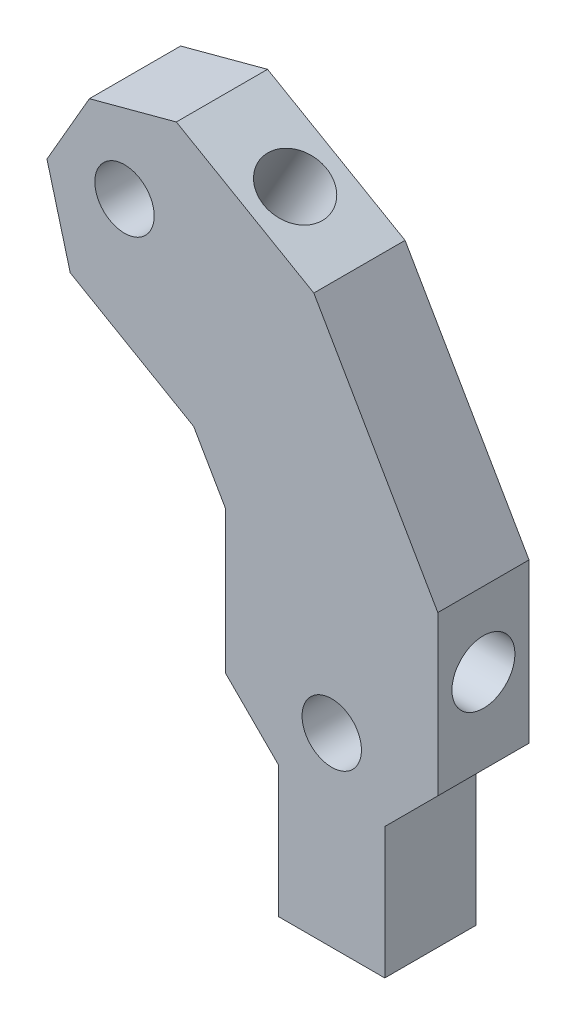
ISO-10303-21;
HEADER;
FILE_DESCRIPTION(('STEP AP214'),'2;1');
FILE_NAME('part.step','',(''),(''),'','','');
FILE_SCHEMA(('AUTOMOTIVE_DESIGN { 1 0 10303 214 1 1 1 1 }'));
ENDSEC;
DATA;
#1=APPLICATION_CONTEXT('core data for automotive mechanical design processes');
#2=APPLICATION_PROTOCOL_DEFINITION('international standard','automotive_design',2000,#1);
#3=PRODUCT_CONTEXT('',#1,'mechanical');
#4=PRODUCT('Part','Part','',(#3));
#5=PRODUCT_RELATED_PRODUCT_CATEGORY('part','',(#4));
#6=PRODUCT_DEFINITION_FORMATION('','',#4);
#7=PRODUCT_DEFINITION_CONTEXT('part definition',#1,'design');
#8=PRODUCT_DEFINITION('design','',#6,#7);
#9=PRODUCT_DEFINITION_SHAPE('','',#8);
#10=(LENGTH_UNIT() NAMED_UNIT(*) SI_UNIT(.MILLI.,.METRE.));
#11=(NAMED_UNIT(*) PLANE_ANGLE_UNIT() SI_UNIT($,.RADIAN.));
#12=(NAMED_UNIT(*) SI_UNIT($,.STERADIAN.) SOLID_ANGLE_UNIT());
#13=UNCERTAINTY_MEASURE_WITH_UNIT(LENGTH_MEASURE(1.E-05),#10,'distance_accuracy_value','');
#14=(GEOMETRIC_REPRESENTATION_CONTEXT(3) GLOBAL_UNCERTAINTY_ASSIGNED_CONTEXT((#13)) GLOBAL_UNIT_ASSIGNED_CONTEXT((#10,
#11,#12)) REPRESENTATION_CONTEXT('',''));
#15=CARTESIAN_POINT('',(0.,0.,0.));
#16=DIRECTION('',(0.,0.,1.));
#17=DIRECTION('',(1.,0.,0.));
#18=AXIS2_PLACEMENT_3D('',#15,#16,#17);
#19=CARTESIAN_POINT('',(34.351,0.0500000000002817,12.8999999999997));
#20=DIRECTION('',(0.707106781186549,0.707106781186546,0.));
#21=DIRECTION('',(-0.707106781186546,0.707106781186549,0.));
#22=AXIS2_PLACEMENT_3D('',#19,#20,#21);
#23=PLANE('',#22);
#24=DIRECTION('',(0.707106781186546,-0.707106781186549,0.));
#25=VECTOR('',#24,1.);
#26=CARTESIAN_POINT('',(34.351,0.0500000000002817,0.));
#27=LINE('',#26,#25);
#28=CARTESIAN_POINT('',(32.851,1.55000000000032,0.));
#29=VERTEX_POINT('',#28);
#30=CARTESIAN_POINT('',(25.351,9.05000000000032,0.));
#31=VERTEX_POINT('',#30);
#32=EDGE_CURVE('E246',#29,#31,#27,.F.);
#33=ORIENTED_EDGE('',*,*,#32,.F.);
#34=DIRECTION('',(0.,0.,-1.));
#35=VECTOR('',#34,1.);
#36=CARTESIAN_POINT('',(32.851,1.55000000000032,36.75586929877));
#37=LINE('',#36,#35);
#38=CARTESIAN_POINT('',(32.851,1.55000000000032,12.8999999999997));
#39=VERTEX_POINT('',#38);
#40=EDGE_CURVE('E166',#39,#29,#37,.T.);
#41=ORIENTED_EDGE('',*,*,#40,.F.);
#42=DIRECTION('',(-0.707106781186546,0.707106781186549,0.));
#43=VECTOR('',#42,1.);
#44=CARTESIAN_POINT('',(-19.6266259888987,54.0276259888993,12.8999999999997));
#45=LINE('',#44,#43);
#46=CARTESIAN_POINT('',(25.351,9.05000000000033,12.8999999999997));
#47=VERTEX_POINT('',#46);
#48=EDGE_CURVE('E157',#47,#39,#45,.F.);
#49=ORIENTED_EDGE('',*,*,#48,.F.);
#50=DIRECTION('',(0.,0.,1.));
#51=VECTOR('',#50,1.);
#52=CARTESIAN_POINT('',(25.351,9.05000000000032,12.8999999999997));
#53=LINE('',#52,#51);
#54=EDGE_CURVE('E248',#31,#47,#53,.T.);
#55=ORIENTED_EDGE('',*,*,#54,.F.);
#56=EDGE_LOOP('',(#33,#41,#49,#55));
#57=FACE_BOUND('',#56,.T.);
#58=ADVANCED_FACE('F35',(#57),#23,.F.);
#59=CARTESIAN_POINT('',(55.351,9.05000000000028,12.8999999999997));
#60=DIRECTION('',(-0.707106781186546,0.707106781186549,0.));
#61=DIRECTION('',(-0.707106781186549,-0.707106781186546,0.));
#62=AXIS2_PLACEMENT_3D('',#59,#60,#61);
#63=PLANE('',#62);
#64=DIRECTION('',(-0.707106781186549,-0.707106781186546,0.));
#65=VECTOR('',#64,1.);
#66=CARTESIAN_POINT('',(79.6392267626231,33.3382267626232,12.8999999999997));
#67=LINE('',#66,#65);
#68=CARTESIAN_POINT('',(47.851,1.55000000000032,12.8999999999997));
#69=VERTEX_POINT('',#68);
#70=CARTESIAN_POINT('',(55.351,9.05000000000029,12.8999999999997));
#71=VERTEX_POINT('',#70);
#72=EDGE_CURVE('E55',#69,#71,#67,.F.);
#73=ORIENTED_EDGE('',*,*,#72,.F.);
#74=DIRECTION('',(0.,0.,-1.));
#75=VECTOR('',#74,1.);
#76=CARTESIAN_POINT('',(47.851,1.55000000000032,36.75586929877));
#77=LINE('',#76,#75);
#78=CARTESIAN_POINT('',(47.851,1.55000000000032,0.));
#79=VERTEX_POINT('',#78);
#80=EDGE_CURVE('E158',#69,#79,#77,.T.);
#81=ORIENTED_EDGE('',*,*,#80,.T.);
#82=DIRECTION('',(0.707106781186549,0.707106781186546,0.));
#83=VECTOR('',#82,1.);
#84=CARTESIAN_POINT('',(55.351,9.05000000000028,0.));
#85=LINE('',#84,#83);
#86=CARTESIAN_POINT('',(55.351,9.05000000000028,0.));
#87=VERTEX_POINT('',#86);
#88=EDGE_CURVE('E243',#87,#79,#85,.F.);
#89=ORIENTED_EDGE('',*,*,#88,.F.);
#90=DIRECTION('',(0.,0.,-1.));
#91=VECTOR('',#90,1.);
#92=CARTESIAN_POINT('',(55.351,9.05000000000028,12.8999999999997));
#93=LINE('',#92,#91);
#94=EDGE_CURVE('E256',#71,#87,#93,.T.);
#95=ORIENTED_EDGE('',*,*,#94,.F.);
#96=EDGE_LOOP('',(#73,#81,#89,#95));
#97=FACE_BOUND('',#96,.T.);
#98=ADVANCED_FACE('F308',(#97),#63,.F.);
#99=CARTESIAN_POINT('',(-4.41723220928326,51.6100906379879,12.8999999999997));
#100=DIRECTION('',(0.500000000000004,0.866025403784436,0.));
#101=DIRECTION('',(-0.866025403784436,0.500000000000004,0.));
#102=AXIS2_PLACEMENT_3D('',#99,#100,#101);
#103=PLANE('',#102);
#104=DIRECTION('',(0.866025403784436,-0.500000000000004,0.));
#105=VECTOR('',#104,1.);
#106=CARTESIAN_POINT('',(-4.41723220928326,51.6100906379879,12.8999999999997));
#107=LINE('',#106,#105);
#108=CARTESIAN_POINT('',(3.37699642477671,47.1100906379878,12.8999999999997));
#109=VERTEX_POINT('',#108);
#110=CARTESIAN_POINT('',(20.8274083110325,37.0350906379881,12.8999999999997));
#111=VERTEX_POINT('',#110);
#112=EDGE_CURVE('E203',#109,#111,#107,.T.);
#113=ORIENTED_EDGE('',*,*,#112,.F.);
#114=DIRECTION('',(0.,0.,-1.));
#115=VECTOR('',#114,1.);
#116=CARTESIAN_POINT('',(3.3769964247767,47.1100906379878,12.8999999999997));
#117=LINE('',#116,#115);
#118=CARTESIAN_POINT('',(3.3769964247767,47.1100906379878,0.));
#119=VERTEX_POINT('',#118);
#120=EDGE_CURVE('E11',#109,#119,#117,.T.);
#121=ORIENTED_EDGE('',*,*,#120,.T.);
#122=DIRECTION('',(0.866025403784436,-0.500000000000004,0.));
#123=VECTOR('',#122,1.);
#124=CARTESIAN_POINT('',(-4.41723220928326,51.6100906379879,0.));
#125=LINE('',#124,#123);
#126=CARTESIAN_POINT('',(20.8274083110325,37.0350906379881,0.));
#127=VERTEX_POINT('',#126);
#128=EDGE_CURVE('E220',#119,#127,#125,.T.);
#129=ORIENTED_EDGE('',*,*,#128,.T.);
#130=DIRECTION('',(0.,0.,-1.));
#131=VECTOR('',#130,1.);
#132=CARTESIAN_POINT('',(20.8274083110325,37.0350906379881,12.8999999999997));
#133=LINE('',#132,#131);
#134=EDGE_CURVE('E233',#111,#127,#133,.T.);
#135=ORIENTED_EDGE('',*,*,#134,.F.);
#136=EDGE_LOOP('',(#113,#121,#129,#135));
#137=FACE_BOUND('',#136,.T.);
#138=CARTESIAN_POINT('',(13.7260000000001,41.1350906379881,6.44999999999984));
#139=DIRECTION('',(-0.500000000000004,-0.866025403784436,0.));
#140=DIRECTION('',(0.866025403784436,-0.500000000000004,0.));
#141=AXIS2_PLACEMENT_3D('',#138,#139,#140);
#142=CIRCLE('',#141,4.44999999999999);
#143=CARTESIAN_POINT('',(17.5798130468408,38.9100906379881,6.44999999999984));
#144=VERTEX_POINT('',#143);
#145=EDGE_CURVE('E168',#144,#144,#142,.T.);
#146=ORIENTED_EDGE('',*,*,#145,.F.);
#147=EDGE_LOOP('',(#146));
#148=FACE_BOUND('',#147,.T.);
#149=ADVANCED_FACE('F287',(#137,#148),#103,.F.);
#150=CARTESIAN_POINT('',(19.6616007737244,93.3158527515222,12.8999999999997));
#151=DIRECTION('',(0.,0.,1.));
#152=DIRECTION('',(1.,0.,0.));
#153=AXIS2_PLACEMENT_3D('',#150,#151,#152);
#154=PLANE('',#153);
#155=DIRECTION('',(0.,1.,0.));
#156=VECTOR('',#155,1.);
#157=CARTESIAN_POINT('',(47.851,-17.,12.8999999999997));
#158=LINE('',#157,#156);
#159=CARTESIAN_POINT('',(47.851,-17.,12.8999999999997));
#160=VERTEX_POINT('',#159);
#161=EDGE_CURVE('E50',#160,#69,#158,.T.);
#162=ORIENTED_EDGE('',*,*,#161,.T.);
#163=ORIENTED_EDGE('',*,*,#72,.T.);
#164=DIRECTION('',(0.,1.,0.));
#165=VECTOR('',#164,1.);
#166=CARTESIAN_POINT('',(55.351,31.5,12.8999999999997));
#167=LINE('',#166,#165);
#168=CARTESIAN_POINT('',(55.351,31.5,12.8999999999997));
#169=VERTEX_POINT('',#168);
#170=EDGE_CURVE('E209',#71,#169,#167,.T.);
#171=ORIENTED_EDGE('',*,*,#170,.T.);
#172=DIRECTION('',(-0.499999999999979,0.866025403784451,0.));
#173=VECTOR('',#172,1.);
#174=CARTESIAN_POINT('',(55.351,31.5,12.8999999999997));
#175=LINE('',#174,#173);
#176=CARTESIAN_POINT('',(37.8192667397381,61.8658527515204,12.8999999999997));
#177=VERTEX_POINT('',#176);
#178=EDGE_CURVE('E193',#169,#177,#175,.T.);
#179=ORIENTED_EDGE('',*,*,#178,.T.);
#180=DIRECTION('',(-0.866025403784436,0.500000000000004,0.));
#181=VECTOR('',#180,1.);
#182=CARTESIAN_POINT('',(37.8192667397381,61.8658527515204,12.8999999999997));
#183=LINE('',#182,#181);
#184=CARTESIAN_POINT('',(18.3769964247767,73.090852751521,12.8999999999997));
#185=VERTEX_POINT('',#184);
#186=EDGE_CURVE('E196',#177,#185,#183,.T.);
#187=ORIENTED_EDGE('',*,*,#186,.T.);
#188=DIRECTION('',(0.96592582628907,0.258819045102515,0.));
#189=VECTOR('',#188,1.);
#190=CARTESIAN_POINT('',(24.6317985992511,74.7668219429878,12.8999999999997));
#191=LINE('',#190,#189);
#192=CARTESIAN_POINT('',(6.08276779071681,69.7966241174611,12.8999999999997));
#193=VERTEX_POINT('',#192);
#194=EDGE_CURVE('E252',#185,#193,#191,.F.);
#195=ORIENTED_EDGE('',*,*,#194,.T.);
#196=DIRECTION('',(-0.500000000000002,-0.866025403784438,0.));
#197=VECTOR('',#196,1.);
#198=CARTESIAN_POINT('',(10.5827677907168,77.590852751521,12.8999999999997));
#199=LINE('',#198,#197);
#200=CARTESIAN_POINT('',(0.0827677907167816,59.4043192720479,12.8999999999997));
#201=VERTEX_POINT('',#200);
#202=EDGE_CURVE('E200',#193,#201,#199,.T.);
#203=ORIENTED_EDGE('',*,*,#202,.T.);
#204=DIRECTION('',(-0.258819045102517,0.965925826289069,0.));
#205=VECTOR('',#204,1.);
#206=CARTESIAN_POINT('',(-7.08358245751655,86.1495025032889,12.8999999999997));
#207=LINE('',#206,#205);
#208=EDGE_CURVE('E250',#201,#109,#207,.F.);
#209=ORIENTED_EDGE('',*,*,#208,.T.);
#210=ORIENTED_EDGE('',*,*,#112,.T.);
#211=DIRECTION('',(0.499999999999979,-0.866025403784451,0.));
#212=VECTOR('',#211,1.);
#213=CARTESIAN_POINT('',(20.8274083110325,37.0350906379881,12.8999999999997));
#214=LINE('',#213,#212);
#215=CARTESIAN_POINT('',(25.351,29.1999999999996,12.8999999999997));
#216=VERTEX_POINT('',#215);
#217=EDGE_CURVE('E205',#111,#216,#214,.T.);
#218=ORIENTED_EDGE('',*,*,#217,.T.);
#219=DIRECTION('',(0.,-1.,0.));
#220=VECTOR('',#219,1.);
#221=CARTESIAN_POINT('',(25.351,0.0500000000002817,12.8999999999997));
#222=LINE('',#221,#220);
#223=EDGE_CURVE('E207',#216,#47,#222,.T.);
#224=ORIENTED_EDGE('',*,*,#223,.T.);
#225=ORIENTED_EDGE('',*,*,#48,.T.);
#226=DIRECTION('',(0.,-1.,0.));
#227=VECTOR('',#226,1.);
#228=CARTESIAN_POINT('',(32.851,1.55000000000032,12.8999999999997));
#229=LINE('',#228,#227);
#230=CARTESIAN_POINT('',(32.851,-17.,12.8999999999997));
#231=VERTEX_POINT('',#230);
#232=EDGE_CURVE('E142',#39,#231,#229,.T.);
#233=ORIENTED_EDGE('',*,*,#232,.T.);
#234=DIRECTION('',(1.,0.,0.));
#235=VECTOR('',#234,1.);
#236=CARTESIAN_POINT('',(32.851,-17.,12.8999999999997));
#237=LINE('',#236,#235);
#238=EDGE_CURVE('E134',#231,#160,#237,.T.);
#239=ORIENTED_EDGE('',*,*,#238,.T.);
#240=EDGE_LOOP('',(#162,#163,#171,#179,#187,#195,#203,#209,#210,#218,#224,#225,#233,#239));
#241=FACE_BOUND('',#240,.T.);
#242=CARTESIAN_POINT('',(40.351,9.25000000000016,12.8999999999997));
#243=DIRECTION('',(0.,0.,1.));
#244=DIRECTION('',(1.,0.,0.));
#245=AXIS2_PLACEMENT_3D('',#242,#243,#244);
#246=CIRCLE('',#245,4.19999999999984);
#247=CARTESIAN_POINT('',(44.5509999999998,9.25000000000016,12.8999999999997));
#248=VERTEX_POINT('',#247);
#249=EDGE_CURVE('E181',#248,#248,#246,.T.);
#250=ORIENTED_EDGE('',*,*,#249,.F.);
#251=EDGE_LOOP('',(#250));
#252=FACE_BOUND('',#251,.T.);
#253=CARTESIAN_POINT('',(11.0502015055335,60.0004716947545,12.8999999999997));
#254=DIRECTION('',(0.,0.,1.));
#255=DIRECTION('',(1.,0.,0.));
#256=AXIS2_PLACEMENT_3D('',#253,#254,#255);
#257=CIRCLE('',#256,4.19999999999974);
#258=CARTESIAN_POINT('',(15.2502015055332,60.0004716947545,12.8999999999997));
#259=VERTEX_POINT('',#258);
#260=EDGE_CURVE('E187',#259,#259,#257,.T.);
#261=ORIENTED_EDGE('',*,*,#260,.F.);
#262=EDGE_LOOP('',(#261));
#263=FACE_BOUND('',#262,.T.);
#264=ADVANCED_FACE('F153',(#241,#252,#263),#154,.T.);
#265=CARTESIAN_POINT('',(19.6616007737244,93.3158527515222,0.));
#266=DIRECTION('',(0.,0.,1.));
#267=DIRECTION('',(1.,0.,0.));
#268=AXIS2_PLACEMENT_3D('',#265,#266,#267);
#269=PLANE('',#268);
#270=DIRECTION('',(0.,-1.,0.));
#271=VECTOR('',#270,1.);
#272=CARTESIAN_POINT('',(32.851,1.55000000000032,0.));
#273=LINE('',#272,#271);
#274=CARTESIAN_POINT('',(32.851,-17.,0.));
#275=VERTEX_POINT('',#274);
#276=EDGE_CURVE('E149',#29,#275,#273,.T.);
#277=ORIENTED_EDGE('',*,*,#276,.F.);
#278=ORIENTED_EDGE('',*,*,#32,.T.);
#279=DIRECTION('',(0.,-1.,0.));
#280=VECTOR('',#279,1.);
#281=CARTESIAN_POINT('',(25.351,0.0500000000002817,0.));
#282=LINE('',#281,#280);
#283=CARTESIAN_POINT('',(25.351,29.1999999999996,0.));
#284=VERTEX_POINT('',#283);
#285=EDGE_CURVE('E224',#284,#31,#282,.T.);
#286=ORIENTED_EDGE('',*,*,#285,.F.);
#287=DIRECTION('',(0.499999999999979,-0.866025403784451,0.));
#288=VECTOR('',#287,1.);
#289=CARTESIAN_POINT('',(20.8274083110325,37.0350906379881,0.));
#290=LINE('',#289,#288);
#291=EDGE_CURVE('E222',#127,#284,#290,.T.);
#292=ORIENTED_EDGE('',*,*,#291,.F.);
#293=ORIENTED_EDGE('',*,*,#128,.F.);
#294=DIRECTION('',(0.258819045102517,-0.965925826289069,0.));
#295=VECTOR('',#294,1.);
#296=CARTESIAN_POINT('',(3.3769964247767,47.1100906379878,0.));
#297=LINE('',#296,#295);
#298=CARTESIAN_POINT('',(0.0827677907167777,59.4043192720479,0.));
#299=VERTEX_POINT('',#298);
#300=EDGE_CURVE('E239',#119,#299,#297,.F.);
#301=ORIENTED_EDGE('',*,*,#300,.T.);
#302=DIRECTION('',(-0.500000000000002,-0.866025403784438,0.));
#303=VECTOR('',#302,1.);
#304=CARTESIAN_POINT('',(10.5827677907168,77.590852751521,0.));
#305=LINE('',#304,#303);
#306=CARTESIAN_POINT('',(6.0827677907168,69.7966241174611,0.));
#307=VERTEX_POINT('',#306);
#308=EDGE_CURVE('E217',#307,#299,#305,.T.);
#309=ORIENTED_EDGE('',*,*,#308,.F.);
#310=DIRECTION('',(-0.96592582628907,-0.258819045102515,0.));
#311=VECTOR('',#310,1.);
#312=CARTESIAN_POINT('',(6.0827677907168,69.7966241174611,0.));
#313=LINE('',#312,#311);
#314=CARTESIAN_POINT('',(18.3769964247767,73.090852751521,0.));
#315=VERTEX_POINT('',#314);
#316=EDGE_CURVE('E241',#307,#315,#313,.F.);
#317=ORIENTED_EDGE('',*,*,#316,.T.);
#318=DIRECTION('',(-0.866025403784436,0.500000000000004,0.));
#319=VECTOR('',#318,1.);
#320=CARTESIAN_POINT('',(37.8192667397381,61.8658527515204,0.));
#321=LINE('',#320,#319);
#322=CARTESIAN_POINT('',(37.8192667397381,61.8658527515204,0.));
#323=VERTEX_POINT('',#322);
#324=EDGE_CURVE('E214',#323,#315,#321,.T.);
#325=ORIENTED_EDGE('',*,*,#324,.F.);
#326=DIRECTION('',(-0.499999999999979,0.866025403784451,0.));
#327=VECTOR('',#326,1.);
#328=CARTESIAN_POINT('',(55.351,31.5,0.));
#329=LINE('',#328,#327);
#330=CARTESIAN_POINT('',(55.351,31.5,0.));
#331=VERTEX_POINT('',#330);
#332=EDGE_CURVE('E190',#331,#323,#329,.T.);
#333=ORIENTED_EDGE('',*,*,#332,.F.);
#334=DIRECTION('',(0.,1.,0.));
#335=VECTOR('',#334,1.);
#336=CARTESIAN_POINT('',(55.351,31.5,0.));
#337=LINE('',#336,#335);
#338=EDGE_CURVE('E197',#87,#331,#337,.T.);
#339=ORIENTED_EDGE('',*,*,#338,.F.);
#340=ORIENTED_EDGE('',*,*,#88,.T.);
#341=DIRECTION('',(0.,1.,0.));
#342=VECTOR('',#341,1.);
#343=CARTESIAN_POINT('',(47.851,-17.,0.));
#344=LINE('',#343,#342);
#345=CARTESIAN_POINT('',(47.851,-17.,0.));
#346=VERTEX_POINT('',#345);
#347=EDGE_CURVE('E161',#346,#79,#344,.T.);
#348=ORIENTED_EDGE('',*,*,#347,.F.);
#349=DIRECTION('',(1.,0.,0.));
#350=VECTOR('',#349,1.);
#351=CARTESIAN_POINT('',(32.851,-17.,0.));
#352=LINE('',#351,#350);
#353=EDGE_CURVE('E150',#275,#346,#352,.T.);
#354=ORIENTED_EDGE('',*,*,#353,.F.);
#355=EDGE_LOOP('',(#277,#278,#286,#292,#293,#301,#309,#317,#325,#333,#339,#340,#348,#354));
#356=FACE_BOUND('',#355,.T.);
#357=CARTESIAN_POINT('',(40.351,9.25000000000016,0.));
#358=DIRECTION('',(0.,0.,1.));
#359=DIRECTION('',(1.,0.,0.));
#360=AXIS2_PLACEMENT_3D('',#357,#358,#359);
#361=CIRCLE('',#360,4.19999999999984);
#362=CARTESIAN_POINT('',(44.5509999999998,9.25000000000016,0.));
#363=VERTEX_POINT('',#362);
#364=EDGE_CURVE('E180',#363,#363,#361,.T.);
#365=ORIENTED_EDGE('',*,*,#364,.T.);
#366=EDGE_LOOP('',(#365));
#367=FACE_BOUND('',#366,.T.);
#368=CARTESIAN_POINT('',(11.0502015055335,60.0004716947545,0.));
#369=DIRECTION('',(0.,0.,1.));
#370=DIRECTION('',(1.,0.,0.));
#371=AXIS2_PLACEMENT_3D('',#368,#369,#370);
#372=CIRCLE('',#371,4.19999999999974);
#373=CARTESIAN_POINT('',(15.2502015055332,60.0004716947545,0.));
#374=VERTEX_POINT('',#373);
#375=EDGE_CURVE('E184',#374,#374,#372,.T.);
#376=ORIENTED_EDGE('',*,*,#375,.T.);
#377=EDGE_LOOP('',(#376));
#378=FACE_BOUND('',#377,.T.);
#379=ADVANCED_FACE('F278',(#356,#367,#378),#269,.F.);
#380=CARTESIAN_POINT('',(55.351,31.5,12.8999999999997));
#381=DIRECTION('',(-0.86602540378445,-0.499999999999979,0.));
#382=DIRECTION('',(0.499999999999979,-0.866025403784451,0.));
#383=AXIS2_PLACEMENT_3D('',#380,#381,#382);
#384=PLANE('',#383);
#385=ORIENTED_EDGE('',*,*,#332,.T.);
#386=DIRECTION('',(0.,0.,-1.));
#387=VECTOR('',#386,1.);
#388=CARTESIAN_POINT('',(37.8192667397381,61.8658527515204,12.8999999999997));
#389=LINE('',#388,#387);
#390=EDGE_CURVE('E236',#177,#323,#389,.T.);
#391=ORIENTED_EDGE('',*,*,#390,.F.);
#392=ORIENTED_EDGE('',*,*,#178,.F.);
#393=DIRECTION('',(0.,0.,-1.));
#394=VECTOR('',#393,1.);
#395=CARTESIAN_POINT('',(55.351,31.5,12.8999999999997));
#396=LINE('',#395,#394);
#397=EDGE_CURVE('E211',#169,#331,#396,.T.);
#398=ORIENTED_EDGE('',*,*,#397,.T.);
#399=EDGE_LOOP('',(#385,#391,#392,#398));
#400=FACE_BOUND('',#399,.T.);
#401=ADVANCED_FACE('F316',(#400),#384,.F.);
#402=CARTESIAN_POINT('',(37.8192667397381,61.8658527515204,12.8999999999997));
#403=DIRECTION('',(-0.500000000000004,-0.866025403784436,0.));
#404=DIRECTION('',(0.866025403784436,-0.500000000000004,0.));
#405=AXIS2_PLACEMENT_3D('',#402,#403,#404);
#406=PLANE('',#405);
#407=CARTESIAN_POINT('',(28.7260000000002,67.1158527515212,6.44999999999984));
#408=DIRECTION('',(-0.500000000000004,-0.866025403784436,0.));
#409=DIRECTION('',(0.866025403784436,-0.500000000000004,0.));
#410=AXIS2_PLACEMENT_3D('',#407,#408,#409);
#411=CIRCLE('',#410,4.44999999999999);
#412=CARTESIAN_POINT('',(32.579813046841,64.8908527515212,6.44999999999984));
#413=VERTEX_POINT('',#412);
#414=EDGE_CURVE('E171',#413,#413,#411,.T.);
#415=ORIENTED_EDGE('',*,*,#414,.T.);
#416=EDGE_LOOP('',(#415));
#417=FACE_BOUND('',#416,.T.);
#418=ORIENTED_EDGE('',*,*,#324,.T.);
#419=DIRECTION('',(0.,0.,1.));
#420=VECTOR('',#419,1.);
#421=CARTESIAN_POINT('',(18.3769964247767,73.090852751521,12.8999999999997));
#422=LINE('',#421,#420);
#423=EDGE_CURVE('E43',#315,#185,#422,.T.);
#424=ORIENTED_EDGE('',*,*,#423,.T.);
#425=ORIENTED_EDGE('',*,*,#186,.F.);
#426=ORIENTED_EDGE('',*,*,#390,.T.);
#427=EDGE_LOOP('',(#418,#424,#425,#426));
#428=FACE_BOUND('',#427,.T.);
#429=ADVANCED_FACE('F265',(#417,#428),#406,.F.);
#430=CARTESIAN_POINT('',(10.5827677907168,77.590852751521,12.8999999999997));
#431=DIRECTION('',(0.866025403784438,-0.500000000000002,0.));
#432=DIRECTION('',(0.500000000000002,0.866025403784438,0.));
#433=AXIS2_PLACEMENT_3D('',#430,#431,#432);
#434=PLANE('',#433);
#435=ORIENTED_EDGE('',*,*,#202,.F.);
#436=DIRECTION('',(0.,0.,-1.));
#437=VECTOR('',#436,1.);
#438=CARTESIAN_POINT('',(6.0827677907168,69.7966241174611,12.8999999999997));
#439=LINE('',#438,#437);
#440=EDGE_CURVE('E261',#193,#307,#439,.T.);
#441=ORIENTED_EDGE('',*,*,#440,.T.);
#442=ORIENTED_EDGE('',*,*,#308,.T.);
#443=DIRECTION('',(0.,0.,1.));
#444=VECTOR('',#443,1.);
#445=CARTESIAN_POINT('',(0.0827677907167777,59.4043192720479,12.8999999999997));
#446=LINE('',#445,#444);
#447=EDGE_CURVE('E259',#299,#201,#446,.T.);
#448=ORIENTED_EDGE('',*,*,#447,.T.);
#449=EDGE_LOOP('',(#435,#441,#442,#448));
#450=FACE_BOUND('',#449,.T.);
#451=ADVANCED_FACE('F275',(#450),#434,.F.);
#452=CARTESIAN_POINT('',(20.8274083110325,37.0350906379881,12.8999999999997));
#453=DIRECTION('',(0.86602540378445,0.499999999999979,0.));
#454=DIRECTION('',(-0.499999999999979,0.866025403784451,0.));
#455=AXIS2_PLACEMENT_3D('',#452,#453,#454);
#456=PLANE('',#455);
#457=ORIENTED_EDGE('',*,*,#291,.T.);
#458=DIRECTION('',(0.,0.,-1.));
#459=VECTOR('',#458,1.);
#460=CARTESIAN_POINT('',(25.351,29.1999999999996,12.8999999999997));
#461=LINE('',#460,#459);
#462=EDGE_CURVE('E230',#216,#284,#461,.T.);
#463=ORIENTED_EDGE('',*,*,#462,.F.);
#464=ORIENTED_EDGE('',*,*,#217,.F.);
#465=ORIENTED_EDGE('',*,*,#134,.T.);
#466=EDGE_LOOP('',(#457,#463,#464,#465));
#467=FACE_BOUND('',#466,.T.);
#468=ADVANCED_FACE('F294',(#467),#456,.F.);
#469=CARTESIAN_POINT('',(25.351,0.0500000000002817,12.8999999999997));
#470=DIRECTION('',(1.,0.,0.));
#471=DIRECTION('',(0.,1.,0.));
#472=AXIS2_PLACEMENT_3D('',#469,#470,#471);
#473=PLANE('',#472);
#474=CARTESIAN_POINT('',(25.351,21.,6.44999999999984));
#475=DIRECTION('',(-1.,0.,0.));
#476=DIRECTION('',(0.,0.,1.));
#477=AXIS2_PLACEMENT_3D('',#474,#475,#476);
#478=CIRCLE('',#477,4.44999999999999);
#479=CARTESIAN_POINT('',(25.351,21.,10.8999999999998));
#480=VERTEX_POINT('',#479);
#481=EDGE_CURVE('E174',#480,#480,#478,.T.);
#482=ORIENTED_EDGE('',*,*,#481,.F.);
#483=EDGE_LOOP('',(#482));
#484=FACE_BOUND('',#483,.T.);
#485=ORIENTED_EDGE('',*,*,#285,.T.);
#486=ORIENTED_EDGE('',*,*,#54,.T.);
#487=ORIENTED_EDGE('',*,*,#223,.F.);
#488=ORIENTED_EDGE('',*,*,#462,.T.);
#489=EDGE_LOOP('',(#485,#486,#487,#488));
#490=FACE_BOUND('',#489,.T.);
#491=ADVANCED_FACE('F297',(#484,#490),#473,.F.);
#492=CARTESIAN_POINT('',(55.351,31.5,12.8999999999997));
#493=DIRECTION('',(-1.,0.,0.));
#494=DIRECTION('',(0.,0.,1.));
#495=AXIS2_PLACEMENT_3D('',#492,#493,#494);
#496=PLANE('',#495);
#497=CARTESIAN_POINT('',(55.351,21.,6.44999999999984));
#498=DIRECTION('',(-1.,0.,0.));
#499=DIRECTION('',(0.,0.,1.));
#500=AXIS2_PLACEMENT_3D('',#497,#498,#499);
#501=CIRCLE('',#500,4.44999999999999);
#502=CARTESIAN_POINT('',(55.351,21.,10.8999999999998));
#503=VERTEX_POINT('',#502);
#504=EDGE_CURVE('E177',#503,#503,#501,.T.);
#505=ORIENTED_EDGE('',*,*,#504,.T.);
#506=EDGE_LOOP('',(#505));
#507=FACE_BOUND('',#506,.T.);
#508=ORIENTED_EDGE('',*,*,#170,.F.);
#509=ORIENTED_EDGE('',*,*,#94,.T.);
#510=ORIENTED_EDGE('',*,*,#338,.T.);
#511=ORIENTED_EDGE('',*,*,#397,.F.);
#512=EDGE_LOOP('',(#508,#509,#510,#511));
#513=FACE_BOUND('',#512,.T.);
#514=ADVANCED_FACE('F314',(#507,#513),#496,.F.);
#515=CARTESIAN_POINT('',(11.0502015055335,60.0004716947545,12.8999999999997));
#516=DIRECTION('',(0.,0.,-1.));
#517=DIRECTION('',(-1.,0.,0.));
#518=AXIS2_PLACEMENT_3D('',#515,#516,#517);
#519=CYLINDRICAL_SURFACE('',#518,4.19999999999974);
#520=ORIENTED_EDGE('',*,*,#260,.T.);
#521=EDGE_LOOP('',(#520));
#522=FACE_BOUND('',#521,.T.);
#523=ORIENTED_EDGE('',*,*,#375,.F.);
#524=EDGE_LOOP('',(#523));
#525=FACE_BOUND('',#524,.T.);
#526=ADVANCED_FACE('F339',(#522,#525),#519,.F.);
#527=CARTESIAN_POINT('',(40.351,9.25000000000016,12.8999999999997));
#528=DIRECTION('',(0.,0.,-1.));
#529=DIRECTION('',(-1.,0.,0.));
#530=AXIS2_PLACEMENT_3D('',#527,#528,#529);
#531=CYLINDRICAL_SURFACE('',#530,4.19999999999984);
#532=ORIENTED_EDGE('',*,*,#249,.T.);
#533=EDGE_LOOP('',(#532));
#534=FACE_BOUND('',#533,.T.);
#535=ORIENTED_EDGE('',*,*,#364,.F.);
#536=EDGE_LOOP('',(#535));
#537=FACE_BOUND('',#536,.T.);
#538=ADVANCED_FACE('F333',(#534,#537),#531,.F.);
#539=CARTESIAN_POINT('',(6.0827677907168,69.7966241174611,12.8999999999997));
#540=DIRECTION('',(0.258819045102515,-0.96592582628907,0.));
#541=DIRECTION('',(0.96592582628907,0.258819045102515,0.));
#542=AXIS2_PLACEMENT_3D('',#539,#540,#541);
#543=PLANE('',#542);
#544=ORIENTED_EDGE('',*,*,#194,.F.);
#545=ORIENTED_EDGE('',*,*,#423,.F.);
#546=ORIENTED_EDGE('',*,*,#316,.F.);
#547=ORIENTED_EDGE('',*,*,#440,.F.);
#548=EDGE_LOOP('',(#544,#545,#546,#547));
#549=FACE_BOUND('',#548,.T.);
#550=ADVANCED_FACE('F272',(#549),#543,.F.);
#551=CARTESIAN_POINT('',(3.3769964247767,47.1100906379878,12.8999999999997));
#552=DIRECTION('',(0.965925826289069,0.258819045102517,0.));
#553=DIRECTION('',(-0.258819045102517,0.965925826289069,0.));
#554=AXIS2_PLACEMENT_3D('',#551,#552,#553);
#555=PLANE('',#554);
#556=ORIENTED_EDGE('',*,*,#208,.F.);
#557=ORIENTED_EDGE('',*,*,#447,.F.);
#558=ORIENTED_EDGE('',*,*,#300,.F.);
#559=ORIENTED_EDGE('',*,*,#120,.F.);
#560=EDGE_LOOP('',(#556,#557,#558,#559));
#561=FACE_BOUND('',#560,.T.);
#562=ADVANCED_FACE('F37',(#561),#555,.F.);
#563=CARTESIAN_POINT('',(25.351,21.,6.44999999999984));
#564=DIRECTION('',(-1.,0.,0.));
#565=DIRECTION('',(0.,0.,1.));
#566=AXIS2_PLACEMENT_3D('',#563,#564,#565);
#567=CYLINDRICAL_SURFACE('',#566,4.44999999999999);
#568=ORIENTED_EDGE('',*,*,#504,.F.);
#569=EDGE_LOOP('',(#568));
#570=FACE_BOUND('',#569,.T.);
#571=ORIENTED_EDGE('',*,*,#481,.T.);
#572=EDGE_LOOP('',(#571));
#573=FACE_BOUND('',#572,.T.);
#574=ADVANCED_FACE('F338',(#570,#573),#567,.F.);
#575=CARTESIAN_POINT('',(13.7260000000001,41.1350906379881,6.44999999999984));
#576=DIRECTION('',(-0.500000000000004,-0.866025403784436,0.));
#577=DIRECTION('',(0.866025403784436,-0.500000000000004,0.));
#578=AXIS2_PLACEMENT_3D('',#575,#576,#577);
#579=CYLINDRICAL_SURFACE('',#578,4.44999999999999);
#580=CARTESIAN_POINT('',(32.579813046841,64.8908527515212,6.44999999999984));
#581=CARTESIAN_POINT('',(32.4235630468409,64.6202198128386,6.44999999999984));
#582=CARTESIAN_POINT('',(32.2673130468409,64.3495868741559,6.44999999999984));
#583=CARTESIAN_POINT('',(31.954813046841,63.8083209967907,6.44999999999984));
#584=CARTESIAN_POINT('',(31.798563046841,63.537688058108,6.44999999999984));
#585=CARTESIAN_POINT('',(31.486063046841,62.9964221807428,6.44999999999984));
#586=CARTESIAN_POINT('',(31.3298130468409,62.7257892420601,6.44999999999984));
#587=CARTESIAN_POINT('',(31.0173130468409,62.1845233646948,6.44999999999984));
#588=CARTESIAN_POINT('',(30.8610630468409,61.9138904260122,6.44999999999984));
#589=CARTESIAN_POINT('',(30.5485630468409,61.3726245486469,6.44999999999984));
#590=CARTESIAN_POINT('',(30.3923130468409,61.1019916099643,6.44999999999984));
#591=CARTESIAN_POINT('',(30.0798130468409,60.560725732599,6.44999999999984));
#592=CARTESIAN_POINT('',(29.9235630468409,60.2900927939164,6.44999999999984));
#593=CARTESIAN_POINT('',(29.6110630468409,59.7488269165511,6.44999999999984));
#594=CARTESIAN_POINT('',(29.4548130468409,59.4781939778685,6.44999999999984));
#595=CARTESIAN_POINT('',(29.1423130468409,58.9369281005032,6.44999999999984));
#596=CARTESIAN_POINT('',(28.9860630468409,58.6662951618206,6.44999999999984));
#597=CARTESIAN_POINT('',(28.6735630468409,58.1250292844553,6.44999999999984));
#598=CARTESIAN_POINT('',(28.5173130468409,57.8543963457727,6.44999999999984));
#599=CARTESIAN_POINT('',(28.2048130468409,57.3131304684074,6.44999999999984));
#600=CARTESIAN_POINT('',(28.0485630468409,57.0424975297248,6.44999999999984));
#601=CARTESIAN_POINT('',(27.7360630468409,56.5012316523595,6.44999999999984));
#602=CARTESIAN_POINT('',(27.5798130468409,56.2305987136769,6.44999999999984));
#603=CARTESIAN_POINT('',(27.2673130468409,55.6893328363116,6.44999999999984));
#604=CARTESIAN_POINT('',(27.1110630468409,55.4186998976289,6.44999999999984));
#605=CARTESIAN_POINT('',(26.7985630468409,54.8774340202637,6.44999999999984));
#606=CARTESIAN_POINT('',(26.6423130468409,54.606801081581,6.44999999999984));
#607=CARTESIAN_POINT('',(26.3298130468409,54.0655352042158,6.44999999999984));
#608=CARTESIAN_POINT('',(26.1735630468409,53.7949022655331,6.44999999999984));
#609=CARTESIAN_POINT('',(25.8610630468409,53.2536363881679,6.44999999999984));
#610=CARTESIAN_POINT('',(25.7048130468409,52.9830034494852,6.44999999999984));
#611=CARTESIAN_POINT('',(25.3923130468409,52.4417375721199,6.44999999999984));
#612=CARTESIAN_POINT('',(25.2360630468409,52.1711046334373,6.44999999999984));
#613=CARTESIAN_POINT('',(24.9235630468409,51.629838756072,6.44999999999984));
#614=CARTESIAN_POINT('',(24.7673130468409,51.3592058173894,6.44999999999984));
#615=CARTESIAN_POINT('',(24.4548130468409,50.8179399400241,6.44999999999984));
#616=CARTESIAN_POINT('',(24.2985630468409,50.5473070013415,6.44999999999984));
#617=CARTESIAN_POINT('',(23.9860630468409,50.0060411239762,6.44999999999984));
#618=CARTESIAN_POINT('',(23.8298130468409,49.7354081852936,6.44999999999984));
#619=CARTESIAN_POINT('',(23.5173130468409,49.1941423079283,6.44999999999984));
#620=CARTESIAN_POINT('',(23.3610630468409,48.9235093692457,6.44999999999984));
#621=CARTESIAN_POINT('',(23.0485630468409,48.3822434918804,6.44999999999984));
#622=CARTESIAN_POINT('',(22.8923130468409,48.1116105531978,6.44999999999984));
#623=CARTESIAN_POINT('',(22.5798130468409,47.5703446758325,6.44999999999984));
#624=CARTESIAN_POINT('',(22.4235630468409,47.2997117371499,6.44999999999984));
#625=CARTESIAN_POINT('',(22.1110630468409,46.7584458597846,6.44999999999984));
#626=CARTESIAN_POINT('',(21.9548130468409,46.4878129211019,6.44999999999984));
#627=CARTESIAN_POINT('',(21.6423130468409,45.9465470437367,6.44999999999984));
#628=CARTESIAN_POINT('',(21.4860630468409,45.675914105054,6.44999999999984));
#629=CARTESIAN_POINT('',(21.1735630468409,45.1346482276888,6.44999999999984));
#630=CARTESIAN_POINT('',(21.0173130468409,44.8640152890061,6.44999999999984));
#631=CARTESIAN_POINT('',(20.7048130468409,44.3227494116409,6.44999999999984));
#632=CARTESIAN_POINT('',(20.5485630468409,44.0521164729582,6.44999999999984));
#633=CARTESIAN_POINT('',(20.2360630468409,43.5108505955929,6.44999999999984));
#634=CARTESIAN_POINT('',(20.0798130468409,43.2402176569103,6.44999999999984));
#635=CARTESIAN_POINT('',(19.7673130468409,42.698951779545,6.44999999999984));
#636=CARTESIAN_POINT('',(19.6110630468409,42.4283188408624,6.44999999999984));
#637=CARTESIAN_POINT('',(19.2985630468408,41.8870529634971,6.44999999999984));
#638=CARTESIAN_POINT('',(19.1423130468408,41.6164200248145,6.44999999999984));
#639=CARTESIAN_POINT('',(18.8298130468408,41.0751541474492,6.44999999999984));
#640=CARTESIAN_POINT('',(18.6735630468408,40.8045212087666,6.44999999999984));
#641=CARTESIAN_POINT('',(18.3610630468408,40.2632553314013,6.44999999999984));
#642=CARTESIAN_POINT('',(18.2048130468408,39.9926223927187,6.44999999999984));
#643=CARTESIAN_POINT('',(17.8923130468408,39.4513565153534,6.44999999999984));
#644=CARTESIAN_POINT('',(17.7360630468408,39.1807235766708,6.44999999999984));
#645=CARTESIAN_POINT('',(17.5798130468408,38.9100906379881,6.44999999999984));
#646=B_SPLINE_CURVE_WITH_KNOTS('',3,(#580,#581,#582,#583,#584,#585,#586,#587,#588,#589,#590,
#591,#592,#593,#594,#595,#596,#597,#598,#599,#600,#601,#602,#603,#604,#605,#606,#607,#608,#609,
#610,#611,#612,#613,#614,#615,#616,#617,#618,#619,#620,#621,#622,#623,#624,#625,#626,#627,#628,
#629,#630,#631,#632,#633,#634,#635,#636,#637,#638,#639,#640,#641,#642,#643,#644,#645),
.UNSPECIFIED.,.F.,.F.,(4,2,2,2,2,2,2,2,2,2,2,2,2,2,2,2,2,2,2,2,2,2,2,2,2,2,2,2,2,2,2,2,4),(0.,
0.937499999999993,1.87499999999998,2.81249999999999,3.74999999999999,4.68749999999999,
5.62499999999999,6.56249999999999,7.49999999999999,8.43749999999999,9.37499999999999,10.3125,
11.25,12.1875,13.125,14.0625,15.,15.9375,16.875,17.8125,18.75,19.6875,20.625,21.5625,22.5,
23.4375,24.375,25.3125,26.25,27.1875,28.125,29.0625,30.),.UNSPECIFIED.);
#647=EDGE_CURVE('BSEAM412',#413,#144,#646,.T.);
#648=ORIENTED_EDGE('',*,*,#414,.F.);
#649=ORIENTED_EDGE('',*,*,#145,.T.);
#650=ORIENTED_EDGE('',*,*,#647,.T.);
#651=ORIENTED_EDGE('',*,*,#647,.F.);
#652=EDGE_LOOP('',(#648,#650,#649,#651));
#653=FACE_BOUND('',#652,.T.);
#654=ADVANCED_FACE('F412',(#653),#579,.F.);
#655=CARTESIAN_POINT('',(32.851,1.55000000000032,36.75586929877));
#656=DIRECTION('',(1.,0.,0.));
#657=DIRECTION('',(0.,0.,-1.));
#658=AXIS2_PLACEMENT_3D('',#655,#656,#657);
#659=PLANE('',#658);
#660=ORIENTED_EDGE('',*,*,#232,.F.);
#661=ORIENTED_EDGE('',*,*,#40,.T.);
#662=ORIENTED_EDGE('',*,*,#276,.T.);
#663=DIRECTION('',(0.,0.,-1.));
#664=VECTOR('',#663,1.);
#665=CARTESIAN_POINT('',(32.851,-17.,36.75586929877));
#666=LINE('',#665,#664);
#667=EDGE_CURVE('E138',#231,#275,#666,.T.);
#668=ORIENTED_EDGE('',*,*,#667,.F.);
#669=EDGE_LOOP('',(#660,#661,#662,#668));
#670=FACE_BOUND('',#669,.T.);
#671=ADVANCED_FACE('F146',(#670),#659,.F.);
#672=CARTESIAN_POINT('',(32.851,-17.,36.75586929877));
#673=DIRECTION('',(0.,1.,0.));
#674=DIRECTION('',(-1.,0.,0.));
#675=AXIS2_PLACEMENT_3D('',#672,#673,#674);
#676=PLANE('',#675);
#677=ORIENTED_EDGE('',*,*,#238,.F.);
#678=ORIENTED_EDGE('',*,*,#667,.T.);
#679=ORIENTED_EDGE('',*,*,#353,.T.);
#680=DIRECTION('',(0.,0.,-1.));
#681=VECTOR('',#680,1.);
#682=CARTESIAN_POINT('',(47.851,-17.,36.75586929877));
#683=LINE('',#682,#681);
#684=EDGE_CURVE('E140',#160,#346,#683,.T.);
#685=ORIENTED_EDGE('',*,*,#684,.F.);
#686=EDGE_LOOP('',(#677,#678,#679,#685));
#687=FACE_BOUND('',#686,.T.);
#688=ADVANCED_FACE('F136',(#687),#676,.F.);
#689=CARTESIAN_POINT('',(47.851,-17.,36.75586929877));
#690=DIRECTION('',(-1.,0.,0.));
#691=DIRECTION('',(0.,-1.,0.));
#692=AXIS2_PLACEMENT_3D('',#689,#690,#691);
#693=PLANE('',#692);
#694=ORIENTED_EDGE('',*,*,#161,.F.);
#695=ORIENTED_EDGE('',*,*,#684,.T.);
#696=ORIENTED_EDGE('',*,*,#347,.T.);
#697=ORIENTED_EDGE('',*,*,#80,.F.);
#698=EDGE_LOOP('',(#694,#695,#696,#697));
#699=FACE_BOUND('',#698,.T.);
#700=ADVANCED_FACE('F306',(#699),#693,.F.);
#701=CLOSED_SHELL('',(#58,#98,#149,#264,#379,#401,#429,#451,#468,#491,#514,#526,#538,#550,#562,
#574,#654,#671,#688,#700));
#702=MANIFOLD_SOLID_BREP('B2',#701);
#703=ADVANCED_BREP_SHAPE_REPRESENTATION('',(#18,#702),#14);
#704=SHAPE_DEFINITION_REPRESENTATION(#9,#703);
ENDSEC;
END-ISO-10303-21;
